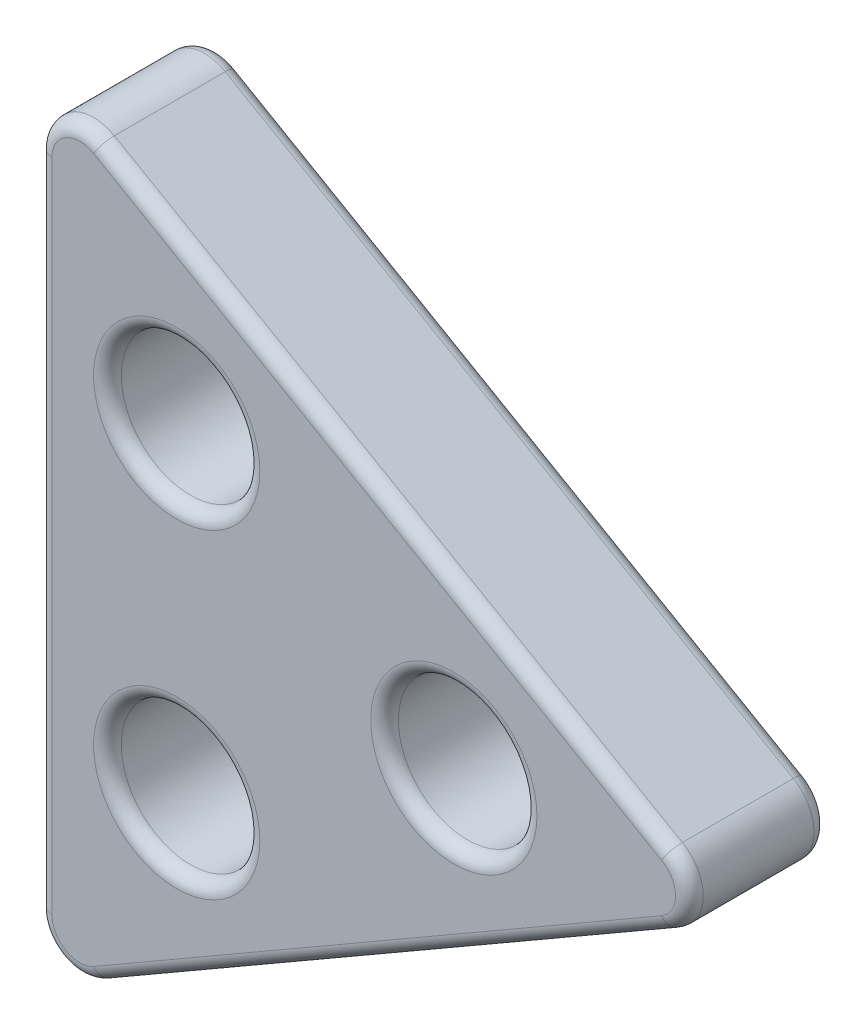
ISO-10303-21;
HEADER;
FILE_DESCRIPTION(('STEP AP214'),'2;1');
FILE_NAME('part.step','',(''),(''),'','','');
FILE_SCHEMA(('AUTOMOTIVE_DESIGN { 1 0 10303 214 1 1 1 1 }'));
ENDSEC;
DATA;
#1=APPLICATION_CONTEXT('core data for automotive mechanical design processes');
#2=APPLICATION_PROTOCOL_DEFINITION('international standard','automotive_design',2000,#1);
#3=PRODUCT_CONTEXT('',#1,'mechanical');
#4=PRODUCT('Part','Part','',(#3));
#5=PRODUCT_RELATED_PRODUCT_CATEGORY('part','',(#4));
#6=PRODUCT_DEFINITION_FORMATION('','',#4);
#7=PRODUCT_DEFINITION_CONTEXT('part definition',#1,'design');
#8=PRODUCT_DEFINITION('design','',#6,#7);
#9=PRODUCT_DEFINITION_SHAPE('','',#8);
#10=(LENGTH_UNIT() NAMED_UNIT(*) SI_UNIT(.MILLI.,.METRE.));
#11=(NAMED_UNIT(*) PLANE_ANGLE_UNIT() SI_UNIT($,.RADIAN.));
#12=(NAMED_UNIT(*) SI_UNIT($,.STERADIAN.) SOLID_ANGLE_UNIT());
#13=UNCERTAINTY_MEASURE_WITH_UNIT(LENGTH_MEASURE(1.E-05),#10,'distance_accuracy_value','');
#14=(GEOMETRIC_REPRESENTATION_CONTEXT(3) GLOBAL_UNCERTAINTY_ASSIGNED_CONTEXT((#13)) GLOBAL_UNIT_ASSIGNED_CONTEXT((#10,
#11,#12)) REPRESENTATION_CONTEXT('',''));
#15=CARTESIAN_POINT('',(0.,0.,0.));
#16=DIRECTION('',(0.,0.,1.));
#17=DIRECTION('',(1.,0.,0.));
#18=AXIS2_PLACEMENT_3D('',#15,#16,#17);
#19=CARTESIAN_POINT('',(-16.6666666666664,-28.8675134594815,10.));
#20=DIRECTION('',(-0.500000000000004,0.866025403784436,0.));
#21=DIRECTION('',(-0.866025403784436,-0.500000000000004,0.));
#22=AXIS2_PLACEMENT_3D('',#19,#20,#21);
#23=PLANE('',#22);
#24=DIRECTION('',(0.,0.,-1.));
#25=VECTOR('',#24,1.);
#26=CARTESIAN_POINT('',(28.8333333333334,-2.59807621135333,10.));
#27=LINE('',#26,#25);
#28=CARTESIAN_POINT('',(28.8333333333334,-2.59807621135333,0.999999999999999));
#29=VERTEX_POINT('',#28);
#30=CARTESIAN_POINT('',(28.8333333333334,-2.59807621135333,9.));
#31=VERTEX_POINT('',#30);
#32=EDGE_CURVE('E278',#29,#31,#27,.F.);
#33=ORIENTED_EDGE('',*,*,#32,.T.);
#34=DIRECTION('',(0.866025403784436,0.500000000000004,0.));
#35=VECTOR('',#34,1.);
#36=CARTESIAN_POINT('',(-12.1666666666665,-26.2694372481282,9.));
#37=LINE('',#36,#35);
#38=CARTESIAN_POINT('',(-12.1666666666664,-26.2694372481282,9.));
#39=VERTEX_POINT('',#38);
#40=EDGE_CURVE('E175',#31,#39,#37,.F.);
#41=ORIENTED_EDGE('',*,*,#40,.T.);
#42=DIRECTION('',(0.,0.,-1.));
#43=VECTOR('',#42,1.);
#44=CARTESIAN_POINT('',(-12.1666666666664,-26.2694372481282,10.));
#45=LINE('',#44,#43);
#46=CARTESIAN_POINT('',(-12.1666666666664,-26.2694372481282,0.999999999999999));
#47=VERTEX_POINT('',#46);
#48=EDGE_CURVE('E276',#39,#47,#45,.T.);
#49=ORIENTED_EDGE('',*,*,#48,.T.);
#50=DIRECTION('',(0.866025403784436,0.500000000000004,0.));
#51=VECTOR('',#50,1.);
#52=CARTESIAN_POINT('',(-16.6666666666664,-28.8675134594815,0.999999999999999));
#53=LINE('',#52,#51);
#54=EDGE_CURVE('E173',#47,#29,#53,.T.);
#55=ORIENTED_EDGE('',*,*,#54,.T.);
#56=EDGE_LOOP('',(#33,#41,#49,#55));
#57=FACE_BOUND('',#56,.T.);
#58=ADVANCED_FACE('F36',(#57),#23,.F.);
#59=CARTESIAN_POINT('',(33.3333333333334,0.,10.));
#60=DIRECTION('',(-0.499999999999998,-0.86602540378444,0.));
#61=DIRECTION('',(0.86602540378444,-0.499999999999998,0.));
#62=AXIS2_PLACEMENT_3D('',#59,#60,#61);
#63=PLANE('',#62);
#64=DIRECTION('',(0.,0.,-1.));
#65=VECTOR('',#64,1.);
#66=CARTESIAN_POINT('',(-12.1666666666668,26.2694372481279,10.));
#67=LINE('',#66,#65);
#68=CARTESIAN_POINT('',(-12.1666666666668,26.2694372481279,0.999999999999999));
#69=VERTEX_POINT('',#68);
#70=CARTESIAN_POINT('',(-12.1666666666668,26.2694372481279,9.));
#71=VERTEX_POINT('',#70);
#72=EDGE_CURVE('E273',#69,#71,#67,.F.);
#73=ORIENTED_EDGE('',*,*,#72,.T.);
#74=DIRECTION('',(-0.86602540378444,0.499999999999998,0.));
#75=VECTOR('',#74,1.);
#76=CARTESIAN_POINT('',(28.8333333333334,2.59807621135329,9.));
#77=LINE('',#76,#75);
#78=CARTESIAN_POINT('',(28.8333333333334,2.59807621135329,9.));
#79=VERTEX_POINT('',#78);
#80=EDGE_CURVE('E166',#71,#79,#77,.F.);
#81=ORIENTED_EDGE('',*,*,#80,.T.);
#82=DIRECTION('',(0.,0.,-1.));
#83=VECTOR('',#82,1.);
#84=CARTESIAN_POINT('',(28.8333333333334,2.59807621135329,10.));
#85=LINE('',#84,#83);
#86=CARTESIAN_POINT('',(28.8333333333334,2.59807621135329,0.999999999999999));
#87=VERTEX_POINT('',#86);
#88=EDGE_CURVE('E268',#79,#87,#85,.T.);
#89=ORIENTED_EDGE('',*,*,#88,.T.);
#90=DIRECTION('',(-0.86602540378444,0.499999999999998,0.));
#91=VECTOR('',#90,1.);
#92=CARTESIAN_POINT('',(33.3333333333334,0.,0.999999999999999));
#93=LINE('',#92,#91);
#94=EDGE_CURVE('E164',#87,#69,#93,.T.);
#95=ORIENTED_EDGE('',*,*,#94,.T.);
#96=EDGE_LOOP('',(#73,#81,#89,#95));
#97=FACE_BOUND('',#96,.T.);
#98=ADVANCED_FACE('F306',(#97),#63,.F.);
#99=CARTESIAN_POINT('',(-16.6666666666668,28.8675134594812,10.));
#100=DIRECTION('',(1.,0.,0.));
#101=DIRECTION('',(0.,1.,0.));
#102=AXIS2_PLACEMENT_3D('',#99,#100,#101);
#103=PLANE('',#102);
#104=DIRECTION('',(0.,0.,-1.));
#105=VECTOR('',#104,1.);
#106=CARTESIAN_POINT('',(-16.6666666666668,23.6713610367746,10.));
#107=LINE('',#106,#105);
#108=CARTESIAN_POINT('',(-16.6666666666668,23.6713610367746,9.));
#109=VERTEX_POINT('',#108);
#110=CARTESIAN_POINT('',(-16.6666666666668,23.6713610367746,0.999999999999999));
#111=VERTEX_POINT('',#110);
#112=EDGE_CURVE('E261',#109,#111,#107,.T.);
#113=ORIENTED_EDGE('',*,*,#112,.T.);
#114=DIRECTION('',(0.,-1.,0.));
#115=VECTOR('',#114,1.);
#116=CARTESIAN_POINT('',(-16.6666666666668,28.8675134594812,0.999999999999999));
#117=LINE('',#116,#115);
#118=CARTESIAN_POINT('',(-16.6666666666665,-23.6713610367749,0.999999999999999));
#119=VERTEX_POINT('',#118);
#120=EDGE_CURVE('E203',#111,#119,#117,.T.);
#121=ORIENTED_EDGE('',*,*,#120,.T.);
#122=DIRECTION('',(0.,0.,-1.));
#123=VECTOR('',#122,1.);
#124=CARTESIAN_POINT('',(-16.6666666666665,-23.6713610367749,10.));
#125=LINE('',#124,#123);
#126=CARTESIAN_POINT('',(-16.6666666666665,-23.6713610367749,9.));
#127=VERTEX_POINT('',#126);
#128=EDGE_CURVE('E230',#119,#127,#125,.F.);
#129=ORIENTED_EDGE('',*,*,#128,.T.);
#130=DIRECTION('',(0.,-1.,0.));
#131=VECTOR('',#130,1.);
#132=CARTESIAN_POINT('',(-16.6666666666668,23.6713610367746,9.));
#133=LINE('',#132,#131);
#134=EDGE_CURVE('E201',#127,#109,#133,.F.);
#135=ORIENTED_EDGE('',*,*,#134,.T.);
#136=EDGE_LOOP('',(#113,#121,#129,#135));
#137=FACE_BOUND('',#136,.T.);
#138=ADVANCED_FACE('F259',(#137),#103,.F.);
#139=CARTESIAN_POINT('',(0.,0.,10.));
#140=DIRECTION('',(0.,0.,1.));
#141=DIRECTION('',(1.,0.,0.));
#142=AXIS2_PLACEMENT_3D('',#139,#140,#141);
#143=PLANE('',#142);
#144=DIRECTION('',(-0.86602540378444,0.499999999999998,0.));
#145=VECTOR('',#144,1.);
#146=CARTESIAN_POINT('',(-12.6666666666668,25.4034118443435,10.));
#147=LINE('',#146,#145);
#148=CARTESIAN_POINT('',(28.3333333333334,1.73205080756885,10.));
#149=VERTEX_POINT('',#148);
#150=CARTESIAN_POINT('',(-12.6666666666668,25.4034118443435,10.));
#151=VERTEX_POINT('',#150);
#152=EDGE_CURVE('E154',#149,#151,#147,.T.);
#153=ORIENTED_EDGE('',*,*,#152,.T.);
#154=CARTESIAN_POINT('',(-13.6666666666668,23.6713610367746,10.));
#155=DIRECTION('',(0.,0.,1.));
#156=DIRECTION('',(1.,0.,0.));
#157=AXIS2_PLACEMENT_3D('',#154,#155,#156);
#158=CIRCLE('',#157,2.);
#159=CARTESIAN_POINT('',(-15.6666666666668,23.6713610367746,10.));
#160=VERTEX_POINT('',#159);
#161=EDGE_CURVE('E134',#151,#160,#158,.T.);
#162=ORIENTED_EDGE('',*,*,#161,.T.);
#163=DIRECTION('',(0.,-1.,0.));
#164=VECTOR('',#163,1.);
#165=CARTESIAN_POINT('',(-15.6666666666665,-23.6713610367749,10.));
#166=LINE('',#165,#164);
#167=CARTESIAN_POINT('',(-15.6666666666665,-23.6713610367749,10.));
#168=VERTEX_POINT('',#167);
#169=EDGE_CURVE('E142',#160,#168,#166,.T.);
#170=ORIENTED_EDGE('',*,*,#169,.T.);
#171=CARTESIAN_POINT('',(-13.6666666666665,-23.6713610367748,10.));
#172=DIRECTION('',(0.,0.,1.));
#173=DIRECTION('',(1.,0.,0.));
#174=AXIS2_PLACEMENT_3D('',#171,#172,#173);
#175=CIRCLE('',#174,2.);
#176=CARTESIAN_POINT('',(-12.6666666666665,-25.4034118443437,10.));
#177=VERTEX_POINT('',#176);
#178=EDGE_CURVE('E148',#168,#177,#175,.T.);
#179=ORIENTED_EDGE('',*,*,#178,.T.);
#180=DIRECTION('',(0.866025403784436,0.500000000000004,0.));
#181=VECTOR('',#180,1.);
#182=CARTESIAN_POINT('',(28.3333333333334,-1.73205080756889,10.));
#183=LINE('',#182,#181);
#184=CARTESIAN_POINT('',(28.3333333333334,-1.7320508075689,10.));
#185=VERTEX_POINT('',#184);
#186=EDGE_CURVE('E290',#177,#185,#183,.T.);
#187=ORIENTED_EDGE('',*,*,#186,.T.);
#188=CARTESIAN_POINT('',(27.3333333333334,0.,10.));
#189=DIRECTION('',(0.,0.,1.));
#190=DIRECTION('',(1.,0.,0.));
#191=AXIS2_PLACEMENT_3D('',#188,#189,#190);
#192=CIRCLE('',#191,2.);
#193=EDGE_CURVE('E159',#185,#149,#192,.T.);
#194=ORIENTED_EDGE('',*,*,#193,.T.);
#195=EDGE_LOOP('',(#153,#162,#170,#179,#187,#194));
#196=FACE_BOUND('',#195,.T.);
#197=CARTESIAN_POINT('',(-6.66666666666667,11.5470053837925,10.));
#198=DIRECTION('',(0.,0.,1.));
#199=DIRECTION('',(1.,0.,0.));
#200=AXIS2_PLACEMENT_3D('',#197,#198,#199);
#201=CIRCLE('',#200,6.);
#202=CARTESIAN_POINT('',(-0.666666666666669,11.5470053837925,10.));
#203=VERTEX_POINT('',#202);
#204=EDGE_CURVE('E149',#203,#203,#201,.F.);
#205=ORIENTED_EDGE('',*,*,#204,.T.);
#206=EDGE_LOOP('',(#205));
#207=FACE_BOUND('',#206,.T.);
#208=CARTESIAN_POINT('',(-6.66666666666667,-11.5470053837925,10.));
#209=DIRECTION('',(0.,0.,1.));
#210=DIRECTION('',(1.,0.,0.));
#211=AXIS2_PLACEMENT_3D('',#208,#209,#210);
#212=CIRCLE('',#211,6.);
#213=CARTESIAN_POINT('',(-0.666666666666665,-11.5470053837925,10.));
#214=VERTEX_POINT('',#213);
#215=EDGE_CURVE('E284',#214,#214,#212,.F.);
#216=ORIENTED_EDGE('',*,*,#215,.T.);
#217=EDGE_LOOP('',(#216));
#218=FACE_BOUND('',#217,.T.);
#219=CARTESIAN_POINT('',(13.3333333333333,0.,10.));
#220=DIRECTION('',(0.,0.,1.));
#221=DIRECTION('',(1.,0.,0.));
#222=AXIS2_PLACEMENT_3D('',#219,#220,#221);
#223=CIRCLE('',#222,6.);
#224=CARTESIAN_POINT('',(19.3333333333333,0.,10.));
#225=VERTEX_POINT('',#224);
#226=EDGE_CURVE('E281',#225,#225,#223,.F.);
#227=ORIENTED_EDGE('',*,*,#226,.T.);
#228=EDGE_LOOP('',(#227));
#229=FACE_BOUND('',#228,.T.);
#230=ADVANCED_FACE('F151',(#196,#207,#218,#229),#143,.T.);
#231=CARTESIAN_POINT('',(0.,0.,0.));
#232=DIRECTION('',(0.,0.,1.));
#233=DIRECTION('',(1.,0.,0.));
#234=AXIS2_PLACEMENT_3D('',#231,#232,#233);
#235=PLANE('',#234);
#236=CARTESIAN_POINT('',(-6.66666666666667,11.5470053837925,0.));
#237=DIRECTION('',(0.,0.,1.));
#238=DIRECTION('',(1.,0.,0.));
#239=AXIS2_PLACEMENT_3D('',#236,#237,#238);
#240=CIRCLE('',#239,6.);
#241=CARTESIAN_POINT('',(-0.666666666666669,11.5470053837925,0.));
#242=VERTEX_POINT('',#241);
#243=EDGE_CURVE('E198',#242,#242,#240,.T.);
#244=ORIENTED_EDGE('',*,*,#243,.T.);
#245=EDGE_LOOP('',(#244));
#246=FACE_BOUND('',#245,.T.);
#247=CARTESIAN_POINT('',(-6.66666666666667,-11.5470053837925,0.));
#248=DIRECTION('',(0.,0.,1.));
#249=DIRECTION('',(1.,0.,0.));
#250=AXIS2_PLACEMENT_3D('',#247,#248,#249);
#251=CIRCLE('',#250,6.);
#252=CARTESIAN_POINT('',(-0.666666666666665,-11.5470053837925,0.));
#253=VERTEX_POINT('',#252);
#254=EDGE_CURVE('E195',#253,#253,#251,.T.);
#255=ORIENTED_EDGE('',*,*,#254,.T.);
#256=EDGE_LOOP('',(#255));
#257=FACE_BOUND('',#256,.T.);
#258=CARTESIAN_POINT('',(13.3333333333333,0.,0.));
#259=DIRECTION('',(0.,0.,1.));
#260=DIRECTION('',(1.,0.,0.));
#261=AXIS2_PLACEMENT_3D('',#258,#259,#260);
#262=CIRCLE('',#261,6.);
#263=CARTESIAN_POINT('',(19.3333333333333,0.,0.));
#264=VERTEX_POINT('',#263);
#265=EDGE_CURVE('E192',#264,#264,#262,.T.);
#266=ORIENTED_EDGE('',*,*,#265,.T.);
#267=EDGE_LOOP('',(#266));
#268=FACE_BOUND('',#267,.T.);
#269=DIRECTION('',(-0.86602540378444,0.499999999999998,0.));
#270=VECTOR('',#269,1.);
#271=CARTESIAN_POINT('',(7.83333333333328,13.5677313259562,0.));
#272=LINE('',#271,#270);
#273=CARTESIAN_POINT('',(-12.6666666666668,25.4034118443435,0.));
#274=VERTEX_POINT('',#273);
#275=CARTESIAN_POINT('',(28.3333333333334,1.73205080756885,0.));
#276=VERTEX_POINT('',#275);
#277=EDGE_CURVE('E181',#274,#276,#272,.F.);
#278=ORIENTED_EDGE('',*,*,#277,.T.);
#279=CARTESIAN_POINT('',(27.3333333333334,0.,0.));
#280=DIRECTION('',(0.,0.,1.));
#281=DIRECTION('',(1.,0.,0.));
#282=AXIS2_PLACEMENT_3D('',#279,#280,#281);
#283=CIRCLE('',#282,2.);
#284=CARTESIAN_POINT('',(28.3333333333334,-1.7320508075689,0.));
#285=VERTEX_POINT('',#284);
#286=EDGE_CURVE('E190',#276,#285,#283,.F.);
#287=ORIENTED_EDGE('',*,*,#286,.T.);
#288=DIRECTION('',(0.866025403784436,0.500000000000004,0.));
#289=VECTOR('',#288,1.);
#290=CARTESIAN_POINT('',(7.83333333333348,-13.5677313259563,0.));
#291=LINE('',#290,#289);
#292=CARTESIAN_POINT('',(-12.6666666666665,-25.4034118443437,0.));
#293=VERTEX_POINT('',#292);
#294=EDGE_CURVE('E60',#285,#293,#291,.F.);
#295=ORIENTED_EDGE('',*,*,#294,.T.);
#296=CARTESIAN_POINT('',(-13.6666666666665,-23.6713610367748,0.));
#297=DIRECTION('',(0.,0.,1.));
#298=DIRECTION('',(1.,0.,0.));
#299=AXIS2_PLACEMENT_3D('',#296,#297,#298);
#300=CIRCLE('',#299,2.);
#301=CARTESIAN_POINT('',(-15.6666666666665,-23.6713610367749,0.));
#302=VERTEX_POINT('',#301);
#303=EDGE_CURVE('E187',#293,#302,#300,.F.);
#304=ORIENTED_EDGE('',*,*,#303,.T.);
#305=DIRECTION('',(0.,-1.,0.));
#306=VECTOR('',#305,1.);
#307=CARTESIAN_POINT('',(-15.6666666666666,-1.09208255897533E-13,0.));
#308=LINE('',#307,#306);
#309=CARTESIAN_POINT('',(-15.6666666666668,23.6713610367746,0.));
#310=VERTEX_POINT('',#309);
#311=EDGE_CURVE('E185',#302,#310,#308,.F.);
#312=ORIENTED_EDGE('',*,*,#311,.T.);
#313=CARTESIAN_POINT('',(-13.6666666666668,23.6713610367746,0.));
#314=DIRECTION('',(0.,0.,1.));
#315=DIRECTION('',(1.,0.,0.));
#316=AXIS2_PLACEMENT_3D('',#313,#314,#315);
#317=CIRCLE('',#316,2.);
#318=EDGE_CURVE('E183',#310,#274,#317,.F.);
#319=ORIENTED_EDGE('',*,*,#318,.T.);
#320=EDGE_LOOP('',(#278,#287,#295,#304,#312,#319));
#321=FACE_BOUND('',#320,.T.);
#322=ADVANCED_FACE('F320',(#246,#257,#268,#321),#235,.F.);
#323=CARTESIAN_POINT('',(13.3333333333333,0.,10.));
#324=DIRECTION('',(0.,0.,-1.));
#325=DIRECTION('',(-1.,0.,0.));
#326=AXIS2_PLACEMENT_3D('',#323,#324,#325);
#327=CYLINDRICAL_SURFACE('',#326,5.);
#328=CARTESIAN_POINT('',(13.3333333333333,0.,9.));
#329=DIRECTION('',(0.,0.,1.));
#330=DIRECTION('',(1.,0.,0.));
#331=AXIS2_PLACEMENT_3D('',#328,#329,#330);
#332=CIRCLE('',#331,5.);
#333=CARTESIAN_POINT('',(18.3333333333333,0.,9.));
#334=VERTEX_POINT('',#333);
#335=EDGE_CURVE('E11',#334,#334,#332,.T.);
#336=ORIENTED_EDGE('',*,*,#335,.T.);
#337=EDGE_LOOP('',(#336));
#338=FACE_BOUND('',#337,.T.);
#339=CARTESIAN_POINT('',(13.3333333333333,0.,0.999999999999999));
#340=DIRECTION('',(0.,0.,1.));
#341=DIRECTION('',(1.,0.,0.));
#342=AXIS2_PLACEMENT_3D('',#339,#340,#341);
#343=CIRCLE('',#342,5.);
#344=CARTESIAN_POINT('',(18.3333333333333,0.,0.999999999999999));
#345=VERTEX_POINT('',#344);
#346=EDGE_CURVE('E45',#345,#345,#343,.F.);
#347=ORIENTED_EDGE('',*,*,#346,.T.);
#348=EDGE_LOOP('',(#347));
#349=FACE_BOUND('',#348,.T.);
#350=ADVANCED_FACE('F516',(#338,#349),#327,.F.);
#351=CARTESIAN_POINT('',(-6.66666666666667,-11.5470053837925,10.));
#352=DIRECTION('',(0.,0.,-1.));
#353=DIRECTION('',(-1.,0.,0.));
#354=AXIS2_PLACEMENT_3D('',#351,#352,#353);
#355=CYLINDRICAL_SURFACE('',#354,5.);
#356=CARTESIAN_POINT('',(-6.66666666666667,-11.5470053837925,0.999999999999999));
#357=DIRECTION('',(0.,0.,1.));
#358=DIRECTION('',(1.,0.,0.));
#359=AXIS2_PLACEMENT_3D('',#356,#357,#358);
#360=CIRCLE('',#359,5.);
#361=CARTESIAN_POINT('',(-1.66666666666667,-11.5470053837925,0.999999999999999));
#362=VERTEX_POINT('',#361);
#363=EDGE_CURVE('E214',#362,#362,#360,.F.);
#364=ORIENTED_EDGE('',*,*,#363,.T.);
#365=EDGE_LOOP('',(#364));
#366=FACE_BOUND('',#365,.T.);
#367=CARTESIAN_POINT('',(-6.66666666666667,-11.5470053837925,9.));
#368=DIRECTION('',(0.,0.,1.));
#369=DIRECTION('',(1.,0.,0.));
#370=AXIS2_PLACEMENT_3D('',#367,#368,#369);
#371=CIRCLE('',#370,5.);
#372=CARTESIAN_POINT('',(-1.66666666666667,-11.5470053837925,9.));
#373=VERTEX_POINT('',#372);
#374=EDGE_CURVE('E211',#373,#373,#371,.T.);
#375=ORIENTED_EDGE('',*,*,#374,.T.);
#376=EDGE_LOOP('',(#375));
#377=FACE_BOUND('',#376,.T.);
#378=ADVANCED_FACE('F507',(#366,#377),#355,.F.);
#379=CARTESIAN_POINT('',(-6.66666666666667,11.5470053837925,10.));
#380=DIRECTION('',(0.,0.,-1.));
#381=DIRECTION('',(-1.,0.,0.));
#382=AXIS2_PLACEMENT_3D('',#379,#380,#381);
#383=CYLINDRICAL_SURFACE('',#382,5.);
#384=CARTESIAN_POINT('',(-6.66666666666667,11.5470053837925,0.999999999999999));
#385=DIRECTION('',(0.,0.,1.));
#386=DIRECTION('',(1.,0.,0.));
#387=AXIS2_PLACEMENT_3D('',#384,#385,#386);
#388=CIRCLE('',#387,5.);
#389=CARTESIAN_POINT('',(-1.66666666666667,11.5470053837925,0.999999999999999));
#390=VERTEX_POINT('',#389);
#391=EDGE_CURVE('E208',#390,#390,#388,.F.);
#392=ORIENTED_EDGE('',*,*,#391,.T.);
#393=EDGE_LOOP('',(#392));
#394=FACE_BOUND('',#393,.T.);
#395=CARTESIAN_POINT('',(-6.66666666666667,11.5470053837925,9.));
#396=DIRECTION('',(0.,0.,1.));
#397=DIRECTION('',(1.,0.,0.));
#398=AXIS2_PLACEMENT_3D('',#395,#396,#397);
#399=CIRCLE('',#398,5.);
#400=CARTESIAN_POINT('',(-1.66666666666667,11.5470053837925,9.));
#401=VERTEX_POINT('',#400);
#402=EDGE_CURVE('E205',#401,#401,#399,.T.);
#403=ORIENTED_EDGE('',*,*,#402,.T.);
#404=EDGE_LOOP('',(#403));
#405=FACE_BOUND('',#404,.T.);
#406=ADVANCED_FACE('F341',(#394,#405),#383,.F.);
#407=CARTESIAN_POINT('',(-13.6666666666668,23.6713610367746,10.));
#408=DIRECTION('',(0.,0.,-1.));
#409=DIRECTION('',(-1.,0.,0.));
#410=AXIS2_PLACEMENT_3D('',#407,#408,#409);
#411=CYLINDRICAL_SURFACE('',#410,3.);
#412=ORIENTED_EDGE('',*,*,#112,.F.);
#413=CARTESIAN_POINT('',(-13.6666666666668,23.6713610367746,9.));
#414=DIRECTION('',(0.,0.,1.));
#415=DIRECTION('',(1.,0.,0.));
#416=AXIS2_PLACEMENT_3D('',#413,#414,#415);
#417=CIRCLE('',#416,3.);
#418=EDGE_CURVE('E136',#109,#71,#417,.F.);
#419=ORIENTED_EDGE('',*,*,#418,.T.);
#420=ORIENTED_EDGE('',*,*,#72,.F.);
#421=CARTESIAN_POINT('',(-13.6666666666668,23.6713610367746,0.999999999999999));
#422=DIRECTION('',(0.,0.,1.));
#423=DIRECTION('',(1.,0.,0.));
#424=AXIS2_PLACEMENT_3D('',#421,#422,#423);
#425=CIRCLE('',#424,3.);
#426=EDGE_CURVE('E156',#69,#111,#425,.T.);
#427=ORIENTED_EDGE('',*,*,#426,.T.);
#428=EDGE_LOOP('',(#412,#419,#420,#427));
#429=FACE_BOUND('',#428,.T.);
#430=ADVANCED_FACE('F305',(#429),#411,.T.);
#431=CARTESIAN_POINT('',(27.3333333333334,0.,10.));
#432=DIRECTION('',(0.,0.,-1.));
#433=DIRECTION('',(-1.,0.,0.));
#434=AXIS2_PLACEMENT_3D('',#431,#432,#433);
#435=CYLINDRICAL_SURFACE('',#434,3.);
#436=ORIENTED_EDGE('',*,*,#88,.F.);
#437=CARTESIAN_POINT('',(27.3333333333334,0.,9.));
#438=DIRECTION('',(0.,0.,1.));
#439=DIRECTION('',(1.,0.,0.));
#440=AXIS2_PLACEMENT_3D('',#437,#438,#439);
#441=CIRCLE('',#440,3.);
#442=EDGE_CURVE('E171',#79,#31,#441,.F.);
#443=ORIENTED_EDGE('',*,*,#442,.T.);
#444=ORIENTED_EDGE('',*,*,#32,.F.);
#445=CARTESIAN_POINT('',(27.3333333333334,0.,0.999999999999999));
#446=DIRECTION('',(0.,0.,1.));
#447=DIRECTION('',(1.,0.,0.));
#448=AXIS2_PLACEMENT_3D('',#445,#446,#447);
#449=CIRCLE('',#448,3.);
#450=EDGE_CURVE('E168',#29,#87,#449,.T.);
#451=ORIENTED_EDGE('',*,*,#450,.T.);
#452=EDGE_LOOP('',(#436,#443,#444,#451));
#453=FACE_BOUND('',#452,.T.);
#454=ADVANCED_FACE('F314',(#453),#435,.T.);
#455=CARTESIAN_POINT('',(-13.6666666666665,-23.6713610367748,10.));
#456=DIRECTION('',(0.,0.,-1.));
#457=DIRECTION('',(-1.,0.,0.));
#458=AXIS2_PLACEMENT_3D('',#455,#456,#457);
#459=CYLINDRICAL_SURFACE('',#458,3.);
#460=ORIENTED_EDGE('',*,*,#48,.F.);
#461=CARTESIAN_POINT('',(-13.6666666666665,-23.6713610367748,9.));
#462=DIRECTION('',(0.,0.,1.));
#463=DIRECTION('',(1.,0.,0.));
#464=AXIS2_PLACEMENT_3D('',#461,#462,#463);
#465=CIRCLE('',#464,3.);
#466=EDGE_CURVE('E179',#39,#127,#465,.F.);
#467=ORIENTED_EDGE('',*,*,#466,.T.);
#468=ORIENTED_EDGE('',*,*,#128,.F.);
#469=CARTESIAN_POINT('',(-13.6666666666665,-23.6713610367748,0.999999999999999));
#470=DIRECTION('',(0.,0.,1.));
#471=DIRECTION('',(1.,0.,0.));
#472=AXIS2_PLACEMENT_3D('',#469,#470,#471);
#473=CIRCLE('',#472,3.);
#474=EDGE_CURVE('E177',#119,#47,#473,.T.);
#475=ORIENTED_EDGE('',*,*,#474,.T.);
#476=EDGE_LOOP('',(#460,#467,#468,#475));
#477=FACE_BOUND('',#476,.T.);
#478=ADVANCED_FACE('F264',(#477),#459,.T.);
#479=CARTESIAN_POINT('',(7.83333333333348,-13.5677313259563,9.));
#480=DIRECTION('',(-0.866025403784436,-0.500000000000004,0.));
#481=DIRECTION('',(0.500000000000004,-0.866025403784436,0.));
#482=AXIS2_PLACEMENT_3D('',#479,#480,#481);
#483=CYLINDRICAL_SURFACE('',#482,1.);
#484=CARTESIAN_POINT('',(-12.6666666666665,-25.4034118443437,9.));
#485=DIRECTION('',(-0.866025403784436,-0.500000000000004,0.));
#486=DIRECTION('',(0.500000000000004,-0.866025403784436,0.));
#487=AXIS2_PLACEMENT_3D('',#484,#485,#486);
#488=CIRCLE('',#487,1.);
#489=EDGE_CURVE('E224',#39,#177,#488,.T.);
#490=ORIENTED_EDGE('',*,*,#489,.F.);
#491=ORIENTED_EDGE('',*,*,#40,.F.);
#492=CARTESIAN_POINT('',(28.3333333333334,-1.7320508075689,9.));
#493=DIRECTION('',(0.866025403784436,0.500000000000004,0.));
#494=DIRECTION('',(-0.500000000000004,0.866025403784436,0.));
#495=AXIS2_PLACEMENT_3D('',#492,#493,#494);
#496=CIRCLE('',#495,1.);
#497=EDGE_CURVE('E227',#185,#31,#496,.T.);
#498=ORIENTED_EDGE('',*,*,#497,.F.);
#499=ORIENTED_EDGE('',*,*,#186,.F.);
#500=EDGE_LOOP('',(#490,#491,#498,#499));
#501=FACE_BOUND('',#500,.T.);
#502=ADVANCED_FACE('F346',(#501),#483,.T.);
#503=CARTESIAN_POINT('',(27.3333333333334,0.,9.));
#504=DIRECTION('',(0.,0.,1.));
#505=DIRECTION('',(1.,0.,0.));
#506=AXIS2_PLACEMENT_3D('',#503,#504,#505);
#507=TOROIDAL_SURFACE('',#506,2.,1.);
#508=ORIENTED_EDGE('',*,*,#497,.T.);
#509=ORIENTED_EDGE('',*,*,#442,.F.);
#510=CARTESIAN_POINT('',(28.3333333333334,1.73205080756885,9.));
#511=DIRECTION('',(-0.86602540378444,0.499999999999997,0.));
#512=DIRECTION('',(-0.499999999999997,-0.866025403784441,0.));
#513=AXIS2_PLACEMENT_3D('',#510,#511,#512);
#514=CIRCLE('',#513,1.);
#515=EDGE_CURVE('E221',#149,#79,#514,.T.);
#516=ORIENTED_EDGE('',*,*,#515,.F.);
#517=ORIENTED_EDGE('',*,*,#193,.F.);
#518=EDGE_LOOP('',(#508,#509,#516,#517));
#519=FACE_BOUND('',#518,.T.);
#520=ADVANCED_FACE('F297',(#519),#507,.T.);
#521=CARTESIAN_POINT('',(-13.6666666666665,-23.6713610367748,9.));
#522=DIRECTION('',(0.,0.,1.));
#523=DIRECTION('',(1.,0.,0.));
#524=AXIS2_PLACEMENT_3D('',#521,#522,#523);
#525=TOROIDAL_SURFACE('',#524,2.,1.);
#526=ORIENTED_EDGE('',*,*,#489,.T.);
#527=ORIENTED_EDGE('',*,*,#178,.F.);
#528=CARTESIAN_POINT('',(-15.6666666666665,-23.6713610367749,9.));
#529=DIRECTION('',(0.,1.,0.));
#530=DIRECTION('',(-1.,0.,0.));
#531=AXIS2_PLACEMENT_3D('',#528,#529,#530);
#532=CIRCLE('',#531,1.);
#533=EDGE_CURVE('E145',#127,#168,#532,.T.);
#534=ORIENTED_EDGE('',*,*,#533,.F.);
#535=ORIENTED_EDGE('',*,*,#466,.F.);
#536=EDGE_LOOP('',(#526,#527,#534,#535));
#537=FACE_BOUND('',#536,.T.);
#538=ADVANCED_FACE('F353',(#537),#525,.T.);
#539=CARTESIAN_POINT('',(7.83333333333328,13.5677313259562,9.));
#540=DIRECTION('',(0.86602540378444,-0.499999999999998,0.));
#541=DIRECTION('',(0.499999999999998,0.86602540378444,0.));
#542=AXIS2_PLACEMENT_3D('',#539,#540,#541);
#543=CYLINDRICAL_SURFACE('',#542,1.);
#544=ORIENTED_EDGE('',*,*,#515,.T.);
#545=ORIENTED_EDGE('',*,*,#80,.F.);
#546=CARTESIAN_POINT('',(-12.6666666666668,25.4034118443435,9.));
#547=DIRECTION('',(-0.866025403784439,0.499999999999999,0.));
#548=DIRECTION('',(-0.499999999999999,-0.866025403784439,0.));
#549=AXIS2_PLACEMENT_3D('',#546,#547,#548);
#550=CIRCLE('',#549,1.);
#551=EDGE_CURVE('E139',#151,#71,#550,.T.);
#552=ORIENTED_EDGE('',*,*,#551,.F.);
#553=ORIENTED_EDGE('',*,*,#152,.F.);
#554=EDGE_LOOP('',(#544,#545,#552,#553));
#555=FACE_BOUND('',#554,.T.);
#556=ADVANCED_FACE('F300',(#555),#543,.T.);
#557=CARTESIAN_POINT('',(-15.6666666666666,-1.09208255897533E-13,9.));
#558=DIRECTION('',(0.,1.,0.));
#559=DIRECTION('',(-1.,0.,0.));
#560=AXIS2_PLACEMENT_3D('',#557,#558,#559);
#561=CYLINDRICAL_SURFACE('',#560,1.);
#562=ORIENTED_EDGE('',*,*,#533,.T.);
#563=ORIENTED_EDGE('',*,*,#169,.F.);
#564=CARTESIAN_POINT('',(-15.6666666666668,23.6713610367746,9.));
#565=DIRECTION('',(0.,1.,0.));
#566=DIRECTION('',(-1.,0.,0.));
#567=AXIS2_PLACEMENT_3D('',#564,#565,#566);
#568=CIRCLE('',#567,1.);
#569=EDGE_CURVE('E130',#109,#160,#568,.T.);
#570=ORIENTED_EDGE('',*,*,#569,.F.);
#571=ORIENTED_EDGE('',*,*,#134,.F.);
#572=EDGE_LOOP('',(#562,#563,#570,#571));
#573=FACE_BOUND('',#572,.T.);
#574=ADVANCED_FACE('F143',(#573),#561,.T.);
#575=CARTESIAN_POINT('',(-13.6666666666668,23.6713610367746,9.));
#576=DIRECTION('',(0.,0.,1.));
#577=DIRECTION('',(1.,0.,0.));
#578=AXIS2_PLACEMENT_3D('',#575,#576,#577);
#579=TOROIDAL_SURFACE('',#578,2.,1.);
#580=ORIENTED_EDGE('',*,*,#551,.T.);
#581=ORIENTED_EDGE('',*,*,#418,.F.);
#582=ORIENTED_EDGE('',*,*,#569,.T.);
#583=ORIENTED_EDGE('',*,*,#161,.F.);
#584=EDGE_LOOP('',(#580,#581,#582,#583));
#585=FACE_BOUND('',#584,.T.);
#586=ADVANCED_FACE('F132',(#585),#579,.T.);
#587=CARTESIAN_POINT('',(-15.6666666666668,28.8675134594813,0.999999999999999));
#588=DIRECTION('',(0.,-1.,0.));
#589=DIRECTION('',(1.,0.,0.));
#590=AXIS2_PLACEMENT_3D('',#587,#588,#589);
#591=CYLINDRICAL_SURFACE('',#590,1.);
#592=CARTESIAN_POINT('',(-15.6666666666665,-23.6713610367749,0.999999999999999));
#593=DIRECTION('',(0.,-1.,0.));
#594=DIRECTION('',(1.,0.,0.));
#595=AXIS2_PLACEMENT_3D('',#592,#593,#594);
#596=CIRCLE('',#595,1.);
#597=EDGE_CURVE('E239',#119,#302,#596,.T.);
#598=ORIENTED_EDGE('',*,*,#597,.F.);
#599=ORIENTED_EDGE('',*,*,#120,.F.);
#600=CARTESIAN_POINT('',(-15.6666666666668,23.6713610367746,1.));
#601=DIRECTION('',(0.,1.,0.));
#602=DIRECTION('',(-1.,0.,0.));
#603=AXIS2_PLACEMENT_3D('',#600,#601,#602);
#604=CIRCLE('',#603,1.);
#605=EDGE_CURVE('E40',#310,#111,#604,.T.);
#606=ORIENTED_EDGE('',*,*,#605,.F.);
#607=ORIENTED_EDGE('',*,*,#311,.F.);
#608=EDGE_LOOP('',(#598,#599,#606,#607));
#609=FACE_BOUND('',#608,.T.);
#610=ADVANCED_FACE('F254',(#609),#591,.T.);
#611=CARTESIAN_POINT('',(-13.6666666666668,23.6713610367746,0.999999999999999));
#612=DIRECTION('',(0.,0.,1.));
#613=DIRECTION('',(1.,0.,0.));
#614=AXIS2_PLACEMENT_3D('',#611,#612,#613);
#615=TOROIDAL_SURFACE('',#614,2.,1.);
#616=ORIENTED_EDGE('',*,*,#605,.T.);
#617=ORIENTED_EDGE('',*,*,#426,.F.);
#618=CARTESIAN_POINT('',(-12.6666666666668,25.4034118443435,1.));
#619=DIRECTION('',(0.86602540378444,-0.499999999999999,0.));
#620=DIRECTION('',(0.499999999999999,0.866025403784439,0.));
#621=AXIS2_PLACEMENT_3D('',#618,#619,#620);
#622=CIRCLE('',#621,1.);
#623=EDGE_CURVE('E237',#274,#69,#622,.T.);
#624=ORIENTED_EDGE('',*,*,#623,.F.);
#625=ORIENTED_EDGE('',*,*,#318,.F.);
#626=EDGE_LOOP('',(#616,#617,#624,#625));
#627=FACE_BOUND('',#626,.T.);
#628=ADVANCED_FACE('F249',(#627),#615,.T.);
#629=CARTESIAN_POINT('',(-13.6666666666665,-23.6713610367748,0.999999999999999));
#630=DIRECTION('',(0.,0.,1.));
#631=DIRECTION('',(1.,0.,0.));
#632=AXIS2_PLACEMENT_3D('',#629,#630,#631);
#633=TOROIDAL_SURFACE('',#632,2.,1.);
#634=ORIENTED_EDGE('',*,*,#597,.T.);
#635=ORIENTED_EDGE('',*,*,#303,.F.);
#636=CARTESIAN_POINT('',(-12.6666666666665,-25.4034118443437,0.999999999999999));
#637=DIRECTION('',(0.866025403784436,0.500000000000004,0.));
#638=DIRECTION('',(-0.500000000000004,0.866025403784436,0.));
#639=AXIS2_PLACEMENT_3D('',#636,#637,#638);
#640=CIRCLE('',#639,1.);
#641=EDGE_CURVE('E234',#47,#293,#640,.T.);
#642=ORIENTED_EDGE('',*,*,#641,.F.);
#643=ORIENTED_EDGE('',*,*,#474,.F.);
#644=EDGE_LOOP('',(#634,#635,#642,#643));
#645=FACE_BOUND('',#644,.T.);
#646=ADVANCED_FACE('F321',(#645),#633,.T.);
#647=CARTESIAN_POINT('',(32.8333333333334,-0.86602540378444,0.999999999999999));
#648=DIRECTION('',(-0.86602540378444,0.499999999999998,0.));
#649=DIRECTION('',(-0.499999999999998,-0.86602540378444,0.));
#650=AXIS2_PLACEMENT_3D('',#647,#648,#649);
#651=CYLINDRICAL_SURFACE('',#650,1.);
#652=ORIENTED_EDGE('',*,*,#623,.T.);
#653=ORIENTED_EDGE('',*,*,#94,.F.);
#654=CARTESIAN_POINT('',(28.3333333333334,1.73205080756885,1.));
#655=DIRECTION('',(0.86602540378444,-0.499999999999997,0.));
#656=DIRECTION('',(0.499999999999997,0.866025403784441,0.));
#657=AXIS2_PLACEMENT_3D('',#654,#655,#656);
#658=CIRCLE('',#657,1.);
#659=EDGE_CURVE('E232',#276,#87,#658,.T.);
#660=ORIENTED_EDGE('',*,*,#659,.F.);
#661=ORIENTED_EDGE('',*,*,#277,.F.);
#662=EDGE_LOOP('',(#652,#653,#660,#661));
#663=FACE_BOUND('',#662,.T.);
#664=ADVANCED_FACE('F310',(#663),#651,.T.);
#665=CARTESIAN_POINT('',(-17.1666666666664,-28.001488055697,0.999999999999999));
#666=DIRECTION('',(0.866025403784436,0.500000000000004,0.));
#667=DIRECTION('',(-0.500000000000004,0.866025403784436,0.));
#668=AXIS2_PLACEMENT_3D('',#665,#666,#667);
#669=CYLINDRICAL_SURFACE('',#668,1.);
#670=ORIENTED_EDGE('',*,*,#641,.T.);
#671=ORIENTED_EDGE('',*,*,#294,.F.);
#672=CARTESIAN_POINT('',(28.3333333333334,-1.7320508075689,0.999999999999999));
#673=DIRECTION('',(0.866025403784436,0.500000000000004,0.));
#674=DIRECTION('',(-0.500000000000004,0.866025403784437,0.));
#675=AXIS2_PLACEMENT_3D('',#672,#673,#674);
#676=CIRCLE('',#675,1.);
#677=EDGE_CURVE('E53',#29,#285,#676,.T.);
#678=ORIENTED_EDGE('',*,*,#677,.F.);
#679=ORIENTED_EDGE('',*,*,#54,.F.);
#680=EDGE_LOOP('',(#670,#671,#678,#679));
#681=FACE_BOUND('',#680,.T.);
#682=ADVANCED_FACE('F318',(#681),#669,.T.);
#683=CARTESIAN_POINT('',(27.3333333333334,0.,0.999999999999999));
#684=DIRECTION('',(0.,0.,1.));
#685=DIRECTION('',(1.,0.,0.));
#686=AXIS2_PLACEMENT_3D('',#683,#684,#685);
#687=TOROIDAL_SURFACE('',#686,2.,1.);
#688=ORIENTED_EDGE('',*,*,#659,.T.);
#689=ORIENTED_EDGE('',*,*,#450,.F.);
#690=ORIENTED_EDGE('',*,*,#677,.T.);
#691=ORIENTED_EDGE('',*,*,#286,.F.);
#692=EDGE_LOOP('',(#688,#689,#690,#691));
#693=FACE_BOUND('',#692,.T.);
#694=ADVANCED_FACE('F315',(#693),#687,.T.);
#695=CARTESIAN_POINT('',(-6.66666666666667,11.5470053837925,0.999999999999999));
#696=DIRECTION('',(0.,0.,1.));
#697=DIRECTION('',(1.,0.,0.));
#698=AXIS2_PLACEMENT_3D('',#695,#696,#697);
#699=TOROIDAL_SURFACE('',#698,6.,1.);
#700=ORIENTED_EDGE('',*,*,#243,.F.);
#701=EDGE_LOOP('',(#700));
#702=FACE_BOUND('',#701,.T.);
#703=ORIENTED_EDGE('',*,*,#391,.F.);
#704=EDGE_LOOP('',(#703));
#705=FACE_BOUND('',#704,.T.);
#706=ADVANCED_FACE('F364',(#702,#705),#699,.T.);
#707=CARTESIAN_POINT('',(-6.66666666666667,11.5470053837925,9.));
#708=DIRECTION('',(0.,0.,1.));
#709=DIRECTION('',(1.,0.,0.));
#710=AXIS2_PLACEMENT_3D('',#707,#708,#709);
#711=TOROIDAL_SURFACE('',#710,6.,1.);
#712=ORIENTED_EDGE('',*,*,#402,.F.);
#713=EDGE_LOOP('',(#712));
#714=FACE_BOUND('',#713,.T.);
#715=ORIENTED_EDGE('',*,*,#204,.F.);
#716=EDGE_LOOP('',(#715));
#717=FACE_BOUND('',#716,.T.);
#718=ADVANCED_FACE('F380',(#714,#717),#711,.T.);
#719=CARTESIAN_POINT('',(-6.66666666666667,-11.5470053837925,0.999999999999999));
#720=DIRECTION('',(0.,0.,1.));
#721=DIRECTION('',(1.,0.,0.));
#722=AXIS2_PLACEMENT_3D('',#719,#720,#721);
#723=TOROIDAL_SURFACE('',#722,6.,1.);
#724=ORIENTED_EDGE('',*,*,#254,.F.);
#725=EDGE_LOOP('',(#724));
#726=FACE_BOUND('',#725,.T.);
#727=ORIENTED_EDGE('',*,*,#363,.F.);
#728=EDGE_LOOP('',(#727));
#729=FACE_BOUND('',#728,.T.);
#730=ADVANCED_FACE('F388',(#726,#729),#723,.T.);
#731=CARTESIAN_POINT('',(-6.66666666666667,-11.5470053837925,9.));
#732=DIRECTION('',(0.,0.,1.));
#733=DIRECTION('',(1.,0.,0.));
#734=AXIS2_PLACEMENT_3D('',#731,#732,#733);
#735=TOROIDAL_SURFACE('',#734,6.,1.);
#736=ORIENTED_EDGE('',*,*,#374,.F.);
#737=EDGE_LOOP('',(#736));
#738=FACE_BOUND('',#737,.T.);
#739=ORIENTED_EDGE('',*,*,#215,.F.);
#740=EDGE_LOOP('',(#739));
#741=FACE_BOUND('',#740,.T.);
#742=ADVANCED_FACE('F396',(#738,#741),#735,.T.);
#743=CARTESIAN_POINT('',(13.3333333333333,0.,9.));
#744=DIRECTION('',(0.,0.,1.));
#745=DIRECTION('',(1.,0.,0.));
#746=AXIS2_PLACEMENT_3D('',#743,#744,#745);
#747=TOROIDAL_SURFACE('',#746,6.,1.);
#748=ORIENTED_EDGE('',*,*,#335,.F.);
#749=EDGE_LOOP('',(#748));
#750=FACE_BOUND('',#749,.T.);
#751=ORIENTED_EDGE('',*,*,#226,.F.);
#752=EDGE_LOOP('',(#751));
#753=FACE_BOUND('',#752,.T.);
#754=ADVANCED_FACE('F404',(#750,#753),#747,.T.);
#755=CARTESIAN_POINT('',(13.3333333333333,0.,0.999999999999999));
#756=DIRECTION('',(0.,0.,1.));
#757=DIRECTION('',(1.,0.,0.));
#758=AXIS2_PLACEMENT_3D('',#755,#756,#757);
#759=TOROIDAL_SURFACE('',#758,6.,1.);
#760=ORIENTED_EDGE('',*,*,#265,.F.);
#761=EDGE_LOOP('',(#760));
#762=FACE_BOUND('',#761,.T.);
#763=ORIENTED_EDGE('',*,*,#346,.F.);
#764=EDGE_LOOP('',(#763));
#765=FACE_BOUND('',#764,.T.);
#766=ADVANCED_FACE('F38',(#762,#765),#759,.T.);
#767=CLOSED_SHELL('',(#58,#98,#138,#230,#322,#350,#378,#406,#430,#454,#478,#502,#520,#538,#556,
#574,#586,#610,#628,#646,#664,#682,#694,#706,#718,#730,#742,#754,#766));
#768=MANIFOLD_SOLID_BREP('B2',#767);
#769=ADVANCED_BREP_SHAPE_REPRESENTATION('',(#18,#768),#14);
#770=SHAPE_DEFINITION_REPRESENTATION(#9,#769);
ENDSEC;
END-ISO-10303-21;
